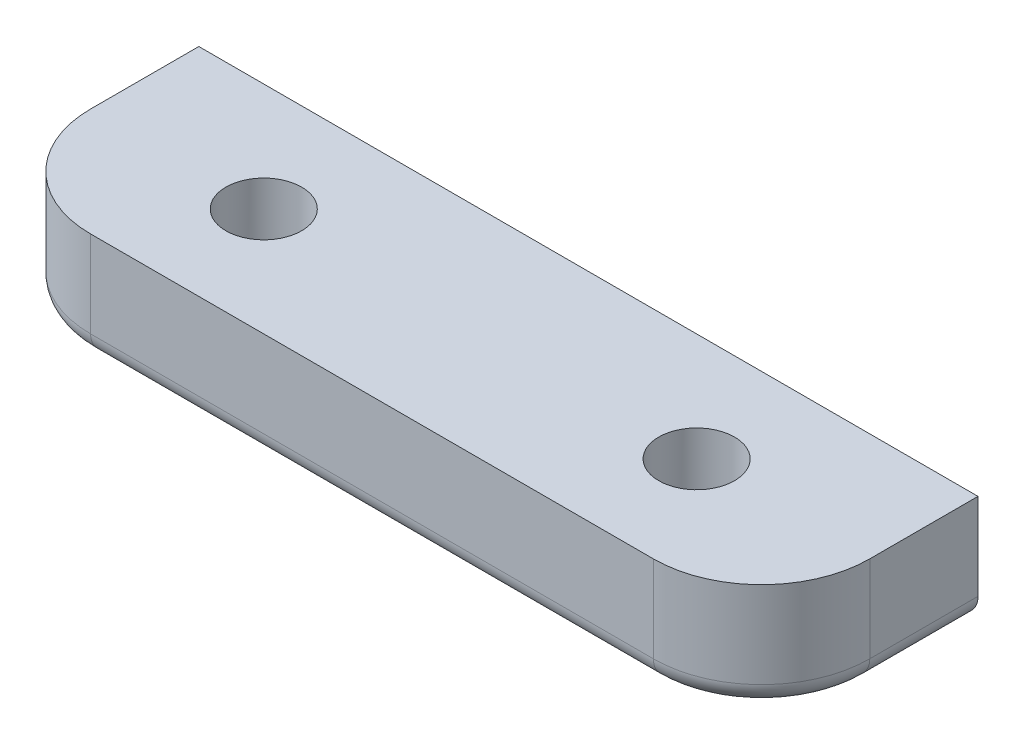
ISO-10303-21;
HEADER;
FILE_DESCRIPTION(('STEP AP214'),'2;1');
FILE_NAME('part.step','',(''),(''),'','','');
FILE_SCHEMA(('AUTOMOTIVE_DESIGN { 1 0 10303 214 1 1 1 1 }'));
ENDSEC;
DATA;
#1=APPLICATION_CONTEXT('core data for automotive mechanical design processes');
#2=APPLICATION_PROTOCOL_DEFINITION('international standard','automotive_design',2000,#1);
#3=PRODUCT_CONTEXT('',#1,'mechanical');
#4=PRODUCT('Part','Part','',(#3));
#5=PRODUCT_RELATED_PRODUCT_CATEGORY('part','',(#4));
#6=PRODUCT_DEFINITION_FORMATION('','',#4);
#7=PRODUCT_DEFINITION_CONTEXT('part definition',#1,'design');
#8=PRODUCT_DEFINITION('design','',#6,#7);
#9=PRODUCT_DEFINITION_SHAPE('','',#8);
#10=(LENGTH_UNIT() NAMED_UNIT(*) SI_UNIT(.MILLI.,.METRE.));
#11=(NAMED_UNIT(*) PLANE_ANGLE_UNIT() SI_UNIT($,.RADIAN.));
#12=(NAMED_UNIT(*) SI_UNIT($,.STERADIAN.) SOLID_ANGLE_UNIT());
#13=UNCERTAINTY_MEASURE_WITH_UNIT(LENGTH_MEASURE(1.E-05),#10,'distance_accuracy_value','');
#14=(GEOMETRIC_REPRESENTATION_CONTEXT(3) GLOBAL_UNCERTAINTY_ASSIGNED_CONTEXT((#13)) GLOBAL_UNIT_ASSIGNED_CONTEXT((#10,
#11,#12)) REPRESENTATION_CONTEXT('',''));
#15=CARTESIAN_POINT('',(0.,0.,0.));
#16=DIRECTION('',(0.,0.,1.));
#17=DIRECTION('',(1.,0.,0.));
#18=AXIS2_PLACEMENT_3D('',#15,#16,#17);
#19=CARTESIAN_POINT('',(10.,-2.5,0.));
#20=DIRECTION('',(0.,1.,0.));
#21=DIRECTION('',(0.,0.,1.));
#22=AXIS2_PLACEMENT_3D('',#19,#20,#21);
#23=CYLINDRICAL_SURFACE('',#22,1.75);
#24=CARTESIAN_POINT('',(10.,2.5,0.));
#25=DIRECTION('',(0.,1.,0.));
#26=DIRECTION('',(0.,0.,1.));
#27=AXIS2_PLACEMENT_3D('',#24,#25,#26);
#28=CIRCLE('',#27,1.75);
#29=CARTESIAN_POINT('',(10.,2.5,1.75));
#30=VERTEX_POINT('',#29);
#31=EDGE_CURVE('E149',#30,#30,#28,.T.);
#32=ORIENTED_EDGE('',*,*,#31,.T.);
#33=EDGE_LOOP('',(#32));
#34=FACE_BOUND('',#33,.T.);
#35=CARTESIAN_POINT('',(10.,-0.5,0.));
#36=DIRECTION('',(0.,-1.,0.));
#37=DIRECTION('',(0.,0.,-1.));
#38=AXIS2_PLACEMENT_3D('',#35,#36,#37);
#39=CIRCLE('',#38,1.75);
#40=CARTESIAN_POINT('',(10.,-0.5,-1.75));
#41=VERTEX_POINT('',#40);
#42=EDGE_CURVE('E145',#41,#41,#39,.F.);
#43=ORIENTED_EDGE('',*,*,#42,.F.);
#44=EDGE_LOOP('',(#43));
#45=FACE_BOUND('',#44,.T.);
#46=ADVANCED_FACE('F36',(#34,#45),#23,.F.);
#47=CARTESIAN_POINT('',(-10.,-2.5,0.));
#48=DIRECTION('',(0.,1.,0.));
#49=DIRECTION('',(0.,0.,1.));
#50=AXIS2_PLACEMENT_3D('',#47,#48,#49);
#51=CYLINDRICAL_SURFACE('',#50,1.75);
#52=CARTESIAN_POINT('',(-10.,2.5,0.));
#53=DIRECTION('',(0.,1.,0.));
#54=DIRECTION('',(0.,0.,1.));
#55=AXIS2_PLACEMENT_3D('',#52,#53,#54);
#56=CIRCLE('',#55,1.75);
#57=CARTESIAN_POINT('',(-10.,2.5,1.75));
#58=VERTEX_POINT('',#57);
#59=EDGE_CURVE('E207',#58,#58,#56,.T.);
#60=ORIENTED_EDGE('',*,*,#59,.T.);
#61=EDGE_LOOP('',(#60));
#62=FACE_BOUND('',#61,.T.);
#63=CARTESIAN_POINT('',(-10.,-0.5,0.));
#64=DIRECTION('',(0.,-1.,0.));
#65=DIRECTION('',(0.,0.,-1.));
#66=AXIS2_PLACEMENT_3D('',#63,#64,#65);
#67=CIRCLE('',#66,1.75);
#68=CARTESIAN_POINT('',(-10.,-0.5,-1.75));
#69=VERTEX_POINT('',#68);
#70=EDGE_CURVE('E142',#69,#69,#67,.F.);
#71=ORIENTED_EDGE('',*,*,#70,.F.);
#72=EDGE_LOOP('',(#71));
#73=FACE_BOUND('',#72,.T.);
#74=ADVANCED_FACE('F260',(#62,#73),#51,.F.);
#75=CARTESIAN_POINT('',(-18.,2.5,5.));
#76=DIRECTION('',(1.,0.,0.));
#77=DIRECTION('',(0.,0.,-1.));
#78=AXIS2_PLACEMENT_3D('',#75,#76,#77);
#79=PLANE('',#78);
#80=DIRECTION('',(0.,-1.,0.));
#81=VECTOR('',#80,1.);
#82=CARTESIAN_POINT('',(-18.,2.5,-5.));
#83=LINE('',#82,#81);
#84=CARTESIAN_POINT('',(-18.,2.5,-5.));
#85=VERTEX_POINT('',#84);
#86=CARTESIAN_POINT('',(-18.,-1.5,-5.));
#87=VERTEX_POINT('',#86);
#88=EDGE_CURVE('E134',#85,#87,#83,.T.);
#89=ORIENTED_EDGE('',*,*,#88,.T.);
#90=DIRECTION('',(0.,0.,-1.));
#91=VECTOR('',#90,1.);
#92=CARTESIAN_POINT('',(-18.,-1.5,5.));
#93=LINE('',#92,#91);
#94=CARTESIAN_POINT('',(-18.,-1.5,0.));
#95=VERTEX_POINT('',#94);
#96=EDGE_CURVE('E175',#87,#95,#93,.F.);
#97=ORIENTED_EDGE('',*,*,#96,.T.);
#98=DIRECTION('',(0.,-1.,0.));
#99=VECTOR('',#98,1.);
#100=CARTESIAN_POINT('',(-18.,2.5,0.));
#101=LINE('',#100,#99);
#102=CARTESIAN_POINT('',(-18.,2.5,0.));
#103=VERTEX_POINT('',#102);
#104=EDGE_CURVE('E153',#95,#103,#101,.F.);
#105=ORIENTED_EDGE('',*,*,#104,.T.);
#106=DIRECTION('',(0.,0.,-1.));
#107=VECTOR('',#106,1.);
#108=CARTESIAN_POINT('',(-18.,2.5,5.));
#109=LINE('',#108,#107);
#110=EDGE_CURVE('E129',#103,#85,#109,.T.);
#111=ORIENTED_EDGE('',*,*,#110,.T.);
#112=EDGE_LOOP('',(#89,#97,#105,#111));
#113=FACE_BOUND('',#112,.T.);
#114=ADVANCED_FACE('F242',(#113),#79,.F.);
#115=CARTESIAN_POINT('',(-18.,-2.5,5.));
#116=DIRECTION('',(0.,1.,0.));
#117=DIRECTION('',(0.,0.,1.));
#118=AXIS2_PLACEMENT_3D('',#115,#116,#117);
#119=PLANE('',#118);
#120=CARTESIAN_POINT('',(-10.,-2.5,0.));
#121=DIRECTION('',(0.,1.,0.));
#122=DIRECTION('',(0.,0.,1.));
#123=AXIS2_PLACEMENT_3D('',#120,#121,#122);
#124=CIRCLE('',#123,3.2);
#125=CARTESIAN_POINT('',(-10.,-2.5,3.2));
#126=VERTEX_POINT('',#125);
#127=EDGE_CURVE('E202',#126,#126,#124,.T.);
#128=ORIENTED_EDGE('',*,*,#127,.T.);
#129=EDGE_LOOP('',(#128));
#130=FACE_BOUND('',#129,.T.);
#131=CARTESIAN_POINT('',(10.,-2.5,0.));
#132=DIRECTION('',(0.,1.,0.));
#133=DIRECTION('',(0.,0.,1.));
#134=AXIS2_PLACEMENT_3D('',#131,#132,#133);
#135=CIRCLE('',#134,3.2);
#136=CARTESIAN_POINT('',(10.,-2.5,3.2));
#137=VERTEX_POINT('',#136);
#138=EDGE_CURVE('E192',#137,#137,#135,.T.);
#139=ORIENTED_EDGE('',*,*,#138,.T.);
#140=EDGE_LOOP('',(#139));
#141=FACE_BOUND('',#140,.T.);
#142=CARTESIAN_POINT('',(-13.,-2.5,0.));
#143=DIRECTION('',(0.,1.,0.));
#144=DIRECTION('',(0.,0.,1.));
#145=AXIS2_PLACEMENT_3D('',#142,#143,#144);
#146=CIRCLE('',#145,4.);
#147=CARTESIAN_POINT('',(-13.,-2.5,4.));
#148=VERTEX_POINT('',#147);
#149=CARTESIAN_POINT('',(-17.,-2.5,0.));
#150=VERTEX_POINT('',#149);
#151=EDGE_CURVE('E166',#148,#150,#146,.F.);
#152=ORIENTED_EDGE('',*,*,#151,.T.);
#153=DIRECTION('',(0.,0.,-1.));
#154=VECTOR('',#153,1.);
#155=CARTESIAN_POINT('',(-17.,-2.5,5.));
#156=LINE('',#155,#154);
#157=CARTESIAN_POINT('',(-17.,-2.5,-5.));
#158=VERTEX_POINT('',#157);
#159=EDGE_CURVE('E168',#150,#158,#156,.T.);
#160=ORIENTED_EDGE('',*,*,#159,.T.);
#161=DIRECTION('',(1.,0.,0.));
#162=VECTOR('',#161,1.);
#163=CARTESIAN_POINT('',(-18.,-2.5,-5.));
#164=LINE('',#163,#162);
#165=CARTESIAN_POINT('',(17.,-2.5,-5.));
#166=VERTEX_POINT('',#165);
#167=EDGE_CURVE('E118',#158,#166,#164,.T.);
#168=ORIENTED_EDGE('',*,*,#167,.T.);
#169=DIRECTION('',(0.,0.,-1.));
#170=VECTOR('',#169,1.);
#171=CARTESIAN_POINT('',(17.,-2.5,5.));
#172=LINE('',#171,#170);
#173=CARTESIAN_POINT('',(17.,-2.5,0.));
#174=VERTEX_POINT('',#173);
#175=EDGE_CURVE('E164',#166,#174,#172,.F.);
#176=ORIENTED_EDGE('',*,*,#175,.T.);
#177=CARTESIAN_POINT('',(13.,-2.5,0.));
#178=DIRECTION('',(0.,1.,0.));
#179=DIRECTION('',(0.,0.,1.));
#180=AXIS2_PLACEMENT_3D('',#177,#178,#179);
#181=CIRCLE('',#180,4.);
#182=CARTESIAN_POINT('',(13.,-2.5,4.));
#183=VERTEX_POINT('',#182);
#184=EDGE_CURVE('E162',#174,#183,#181,.F.);
#185=ORIENTED_EDGE('',*,*,#184,.T.);
#186=DIRECTION('',(1.,0.,0.));
#187=VECTOR('',#186,1.);
#188=CARTESIAN_POINT('',(-13.,-2.5,4.));
#189=LINE('',#188,#187);
#190=EDGE_CURVE('E160',#183,#148,#189,.F.);
#191=ORIENTED_EDGE('',*,*,#190,.T.);
#192=EDGE_LOOP('',(#152,#160,#168,#176,#185,#191));
#193=FACE_BOUND('',#192,.T.);
#194=ADVANCED_FACE('F227',(#130,#141,#193),#119,.F.);
#195=CARTESIAN_POINT('',(18.,2.5,5.));
#196=DIRECTION('',(-1.,0.,0.));
#197=DIRECTION('',(0.,0.,1.));
#198=AXIS2_PLACEMENT_3D('',#195,#196,#197);
#199=PLANE('',#198);
#200=DIRECTION('',(0.,1.,0.));
#201=VECTOR('',#200,1.);
#202=CARTESIAN_POINT('',(18.,-2.5,0.));
#203=LINE('',#202,#201);
#204=CARTESIAN_POINT('',(18.,2.5,0.));
#205=VERTEX_POINT('',#204);
#206=CARTESIAN_POINT('',(18.,-1.5,0.));
#207=VERTEX_POINT('',#206);
#208=EDGE_CURVE('E158',#205,#207,#203,.F.);
#209=ORIENTED_EDGE('',*,*,#208,.T.);
#210=DIRECTION('',(0.,0.,-1.));
#211=VECTOR('',#210,1.);
#212=CARTESIAN_POINT('',(18.,-1.5,5.));
#213=LINE('',#212,#211);
#214=CARTESIAN_POINT('',(18.,-1.5,-5.));
#215=VERTEX_POINT('',#214);
#216=EDGE_CURVE('E113',#207,#215,#213,.T.);
#217=ORIENTED_EDGE('',*,*,#216,.T.);
#218=DIRECTION('',(0.,1.,0.));
#219=VECTOR('',#218,1.);
#220=CARTESIAN_POINT('',(18.,2.5,-5.));
#221=LINE('',#220,#219);
#222=CARTESIAN_POINT('',(18.,2.5,-5.));
#223=VERTEX_POINT('',#222);
#224=EDGE_CURVE('E108',#215,#223,#221,.T.);
#225=ORIENTED_EDGE('',*,*,#224,.T.);
#226=DIRECTION('',(0.,0.,-1.));
#227=VECTOR('',#226,1.);
#228=CARTESIAN_POINT('',(18.,2.5,5.));
#229=LINE('',#228,#227);
#230=EDGE_CURVE('E111',#205,#223,#229,.T.);
#231=ORIENTED_EDGE('',*,*,#230,.F.);
#232=EDGE_LOOP('',(#209,#217,#225,#231));
#233=FACE_BOUND('',#232,.T.);
#234=ADVANCED_FACE('F110',(#233),#199,.F.);
#235=CARTESIAN_POINT('',(-18.,2.5,5.));
#236=DIRECTION('',(0.,-1.,0.));
#237=DIRECTION('',(0.,0.,-1.));
#238=AXIS2_PLACEMENT_3D('',#235,#236,#237);
#239=PLANE('',#238);
#240=ORIENTED_EDGE('',*,*,#59,.F.);
#241=EDGE_LOOP('',(#240));
#242=FACE_BOUND('',#241,.T.);
#243=ORIENTED_EDGE('',*,*,#31,.F.);
#244=EDGE_LOOP('',(#243));
#245=FACE_BOUND('',#244,.T.);
#246=ORIENTED_EDGE('',*,*,#110,.F.);
#247=CARTESIAN_POINT('',(-13.,2.5,0.));
#248=DIRECTION('',(0.,-1.,0.));
#249=DIRECTION('',(0.,0.,-1.));
#250=AXIS2_PLACEMENT_3D('',#247,#248,#249);
#251=CIRCLE('',#250,5.);
#252=CARTESIAN_POINT('',(-13.,2.5,5.));
#253=VERTEX_POINT('',#252);
#254=EDGE_CURVE('E156',#103,#253,#251,.F.);
#255=ORIENTED_EDGE('',*,*,#254,.T.);
#256=DIRECTION('',(-1.,0.,0.));
#257=VECTOR('',#256,1.);
#258=CARTESIAN_POINT('',(-18.,2.5,5.));
#259=LINE('',#258,#257);
#260=CARTESIAN_POINT('',(13.,2.5,5.));
#261=VERTEX_POINT('',#260);
#262=EDGE_CURVE('E135',#261,#253,#259,.T.);
#263=ORIENTED_EDGE('',*,*,#262,.F.);
#264=CARTESIAN_POINT('',(13.,2.5,0.));
#265=DIRECTION('',(0.,-1.,0.));
#266=DIRECTION('',(0.,0.,-1.));
#267=AXIS2_PLACEMENT_3D('',#264,#265,#266);
#268=CIRCLE('',#267,5.);
#269=EDGE_CURVE('E127',#261,#205,#268,.F.);
#270=ORIENTED_EDGE('',*,*,#269,.T.);
#271=ORIENTED_EDGE('',*,*,#230,.T.);
#272=DIRECTION('',(-1.,0.,0.));
#273=VECTOR('',#272,1.);
#274=CARTESIAN_POINT('',(-18.,2.5,-5.));
#275=LINE('',#274,#273);
#276=EDGE_CURVE('E117',#223,#85,#275,.T.);
#277=ORIENTED_EDGE('',*,*,#276,.T.);
#278=EDGE_LOOP('',(#246,#255,#263,#270,#271,#277));
#279=FACE_BOUND('',#278,.T.);
#280=ADVANCED_FACE('F123',(#242,#245,#279),#239,.F.);
#281=CARTESIAN_POINT('',(0.,0.,5.));
#282=DIRECTION('',(0.,0.,1.));
#283=DIRECTION('',(1.,0.,0.));
#284=AXIS2_PLACEMENT_3D('',#281,#282,#283);
#285=PLANE('',#284);
#286=DIRECTION('',(0.,-1.,0.));
#287=VECTOR('',#286,1.);
#288=CARTESIAN_POINT('',(-13.,-2.5,5.));
#289=LINE('',#288,#287);
#290=CARTESIAN_POINT('',(-13.,-1.5,5.));
#291=VERTEX_POINT('',#290);
#292=EDGE_CURVE('E151',#253,#291,#289,.T.);
#293=ORIENTED_EDGE('',*,*,#292,.T.);
#294=DIRECTION('',(1.,0.,0.));
#295=VECTOR('',#294,1.);
#296=CARTESIAN_POINT('',(13.,-1.5,5.));
#297=LINE('',#296,#295);
#298=CARTESIAN_POINT('',(13.,-1.5,5.));
#299=VERTEX_POINT('',#298);
#300=EDGE_CURVE('E12',#291,#299,#297,.T.);
#301=ORIENTED_EDGE('',*,*,#300,.T.);
#302=DIRECTION('',(0.,1.,0.));
#303=VECTOR('',#302,1.);
#304=CARTESIAN_POINT('',(13.,2.5,5.));
#305=LINE('',#304,#303);
#306=EDGE_CURVE('E128',#299,#261,#305,.T.);
#307=ORIENTED_EDGE('',*,*,#306,.T.);
#308=ORIENTED_EDGE('',*,*,#262,.T.);
#309=EDGE_LOOP('',(#293,#301,#307,#308));
#310=FACE_BOUND('',#309,.T.);
#311=ADVANCED_FACE('F248',(#310),#285,.T.);
#312=CARTESIAN_POINT('',(0.,0.,-5.));
#313=DIRECTION('',(0.,0.,1.));
#314=DIRECTION('',(1.,0.,0.));
#315=AXIS2_PLACEMENT_3D('',#312,#313,#314);
#316=PLANE('',#315);
#317=CARTESIAN_POINT('',(14.75,-0.500000000000004,-5.));
#318=DIRECTION('',(0.,0.,-1.));
#319=DIRECTION('',(-1.,0.,0.));
#320=AXIS2_PLACEMENT_3D('',#317,#318,#319);
#321=CIRCLE('',#320,1.);
#322=CARTESIAN_POINT('',(13.75,-0.500000000000004,-5.));
#323=VERTEX_POINT('',#322);
#324=EDGE_CURVE('E216',#323,#323,#321,.T.);
#325=ORIENTED_EDGE('',*,*,#324,.F.);
#326=EDGE_LOOP('',(#325));
#327=FACE_BOUND('',#326,.T.);
#328=CARTESIAN_POINT('',(-14.75,0.,-5.));
#329=DIRECTION('',(0.,0.,-1.));
#330=DIRECTION('',(-1.,0.,0.));
#331=AXIS2_PLACEMENT_3D('',#328,#329,#330);
#332=CIRCLE('',#331,1.);
#333=CARTESIAN_POINT('',(-15.75,0.,-5.));
#334=VERTEX_POINT('',#333);
#335=EDGE_CURVE('E210',#334,#334,#332,.T.);
#336=ORIENTED_EDGE('',*,*,#335,.F.);
#337=EDGE_LOOP('',(#336));
#338=FACE_BOUND('',#337,.T.);
#339=ORIENTED_EDGE('',*,*,#167,.F.);
#340=CARTESIAN_POINT('',(-17.,-1.5,-5.));
#341=DIRECTION('',(0.,0.,1.));
#342=DIRECTION('',(1.,0.,0.));
#343=AXIS2_PLACEMENT_3D('',#340,#341,#342);
#344=CIRCLE('',#343,1.);
#345=EDGE_CURVE('E173',#158,#87,#344,.F.);
#346=ORIENTED_EDGE('',*,*,#345,.T.);
#347=ORIENTED_EDGE('',*,*,#88,.F.);
#348=ORIENTED_EDGE('',*,*,#276,.F.);
#349=ORIENTED_EDGE('',*,*,#224,.F.);
#350=CARTESIAN_POINT('',(17.,-1.5,-5.));
#351=DIRECTION('',(0.,0.,1.));
#352=DIRECTION('',(1.,0.,0.));
#353=AXIS2_PLACEMENT_3D('',#350,#351,#352);
#354=CIRCLE('',#353,1.);
#355=EDGE_CURVE('E171',#215,#166,#354,.F.);
#356=ORIENTED_EDGE('',*,*,#355,.T.);
#357=EDGE_LOOP('',(#339,#346,#347,#348,#349,#356));
#358=FACE_BOUND('',#357,.T.);
#359=ADVANCED_FACE('F132',(#327,#338,#358),#316,.F.);
#360=CARTESIAN_POINT('',(-14.75,0.,4.));
#361=DIRECTION('',(0.,0.,-1.));
#362=DIRECTION('',(-1.,0.,0.));
#363=AXIS2_PLACEMENT_3D('',#360,#361,#362);
#364=CYLINDRICAL_SURFACE('',#363,1.);
#365=CARTESIAN_POINT('',(-14.75,0.,4.));
#366=DIRECTION('',(0.,0.,-1.));
#367=DIRECTION('',(-1.,0.,0.));
#368=AXIS2_PLACEMENT_3D('',#365,#366,#367);
#369=CIRCLE('',#368,1.);
#370=CARTESIAN_POINT('',(-15.75,0.,4.));
#371=VERTEX_POINT('',#370);
#372=EDGE_CURVE('E219',#371,#371,#369,.T.);
#373=ORIENTED_EDGE('',*,*,#372,.F.);
#374=EDGE_LOOP('',(#373));
#375=FACE_BOUND('',#374,.T.);
#376=ORIENTED_EDGE('',*,*,#335,.T.);
#377=EDGE_LOOP('',(#376));
#378=FACE_BOUND('',#377,.T.);
#379=ADVANCED_FACE('F283',(#375,#378),#364,.F.);
#380=CARTESIAN_POINT('',(-14.75,0.,4.));
#381=DIRECTION('',(0.,0.,-1.));
#382=DIRECTION('',(-1.,0.,0.));
#383=AXIS2_PLACEMENT_3D('',#380,#381,#382);
#384=PLANE('',#383);
#385=ORIENTED_EDGE('',*,*,#372,.T.);
#386=EDGE_LOOP('',(#385));
#387=FACE_BOUND('',#386,.T.);
#388=ADVANCED_FACE('F279',(#387),#384,.T.);
#389=CARTESIAN_POINT('',(14.75,-0.500000000000004,4.));
#390=DIRECTION('',(0.,0.,-1.));
#391=DIRECTION('',(-1.,0.,0.));
#392=AXIS2_PLACEMENT_3D('',#389,#390,#391);
#393=CYLINDRICAL_SURFACE('',#392,1.);
#394=CARTESIAN_POINT('',(14.75,-0.500000000000004,4.));
#395=DIRECTION('',(0.,0.,-1.));
#396=DIRECTION('',(-1.,0.,0.));
#397=AXIS2_PLACEMENT_3D('',#394,#395,#396);
#398=CIRCLE('',#397,1.);
#399=CARTESIAN_POINT('',(13.75,-0.500000000000004,4.));
#400=VERTEX_POINT('',#399);
#401=EDGE_CURVE('E213',#400,#400,#398,.T.);
#402=ORIENTED_EDGE('',*,*,#401,.F.);
#403=EDGE_LOOP('',(#402));
#404=FACE_BOUND('',#403,.T.);
#405=ORIENTED_EDGE('',*,*,#324,.T.);
#406=EDGE_LOOP('',(#405));
#407=FACE_BOUND('',#406,.T.);
#408=ADVANCED_FACE('F275',(#404,#407),#393,.F.);
#409=CARTESIAN_POINT('',(14.75,-0.500000000000004,4.));
#410=DIRECTION('',(0.,0.,-1.));
#411=DIRECTION('',(-1.,0.,0.));
#412=AXIS2_PLACEMENT_3D('',#409,#410,#411);
#413=PLANE('',#412);
#414=ORIENTED_EDGE('',*,*,#401,.T.);
#415=EDGE_LOOP('',(#414));
#416=FACE_BOUND('',#415,.T.);
#417=ADVANCED_FACE('F271',(#416),#413,.T.);
#418=CARTESIAN_POINT('',(-18.,-0.5,5.));
#419=DIRECTION('',(0.,-1.,0.));
#420=DIRECTION('',(0.,0.,-1.));
#421=AXIS2_PLACEMENT_3D('',#418,#419,#420);
#422=PLANE('',#421);
#423=CARTESIAN_POINT('',(-10.,-0.5,0.));
#424=DIRECTION('',(0.,-1.,0.));
#425=DIRECTION('',(0.,0.,-1.));
#426=AXIS2_PLACEMENT_3D('',#423,#424,#425);
#427=CIRCLE('',#426,3.2);
#428=CARTESIAN_POINT('',(-10.,-0.5,-3.2));
#429=VERTEX_POINT('',#428);
#430=EDGE_CURVE('E146',#429,#429,#427,.T.);
#431=ORIENTED_EDGE('',*,*,#430,.T.);
#432=EDGE_LOOP('',(#431));
#433=FACE_BOUND('',#432,.T.);
#434=ORIENTED_EDGE('',*,*,#70,.T.);
#435=EDGE_LOOP('',(#434));
#436=FACE_BOUND('',#435,.T.);
#437=ADVANCED_FACE('F274',(#433,#436),#422,.T.);
#438=CARTESIAN_POINT('',(-10.,11.5509667991878,0.));
#439=DIRECTION('',(0.,-1.,0.));
#440=DIRECTION('',(0.,0.,-1.));
#441=AXIS2_PLACEMENT_3D('',#438,#439,#440);
#442=CYLINDRICAL_SURFACE('',#441,3.2);
#443=ORIENTED_EDGE('',*,*,#430,.F.);
#444=EDGE_LOOP('',(#443));
#445=FACE_BOUND('',#444,.T.);
#446=ORIENTED_EDGE('',*,*,#127,.F.);
#447=EDGE_LOOP('',(#446));
#448=FACE_BOUND('',#447,.T.);
#449=ADVANCED_FACE('F350',(#445,#448),#442,.F.);
#450=CARTESIAN_POINT('',(-18.,-0.5,5.));
#451=DIRECTION('',(0.,-1.,0.));
#452=DIRECTION('',(0.,0.,-1.));
#453=AXIS2_PLACEMENT_3D('',#450,#451,#452);
#454=PLANE('',#453);
#455=CARTESIAN_POINT('',(10.,-0.5,0.));
#456=DIRECTION('',(0.,-1.,0.));
#457=DIRECTION('',(0.,0.,-1.));
#458=AXIS2_PLACEMENT_3D('',#455,#456,#457);
#459=CIRCLE('',#458,3.2);
#460=CARTESIAN_POINT('',(10.,-0.5,-3.2));
#461=VERTEX_POINT('',#460);
#462=EDGE_CURVE('E197',#461,#461,#459,.T.);
#463=ORIENTED_EDGE('',*,*,#462,.T.);
#464=EDGE_LOOP('',(#463));
#465=FACE_BOUND('',#464,.T.);
#466=ORIENTED_EDGE('',*,*,#42,.T.);
#467=EDGE_LOOP('',(#466));
#468=FACE_BOUND('',#467,.T.);
#469=ADVANCED_FACE('F358',(#465,#468),#454,.T.);
#470=CARTESIAN_POINT('',(10.,11.5509667991878,0.));
#471=DIRECTION('',(0.,-1.,0.));
#472=DIRECTION('',(0.,0.,-1.));
#473=AXIS2_PLACEMENT_3D('',#470,#471,#472);
#474=CYLINDRICAL_SURFACE('',#473,3.2);
#475=ORIENTED_EDGE('',*,*,#462,.F.);
#476=EDGE_LOOP('',(#475));
#477=FACE_BOUND('',#476,.T.);
#478=ORIENTED_EDGE('',*,*,#138,.F.);
#479=EDGE_LOOP('',(#478));
#480=FACE_BOUND('',#479,.T.);
#481=ADVANCED_FACE('F256',(#477,#480),#474,.F.);
#482=CARTESIAN_POINT('',(-13.,0.,0.));
#483=DIRECTION('',(0.,1.,0.));
#484=DIRECTION('',(0.,0.,1.));
#485=AXIS2_PLACEMENT_3D('',#482,#483,#484);
#486=CYLINDRICAL_SURFACE('',#485,5.);
#487=ORIENTED_EDGE('',*,*,#104,.F.);
#488=CARTESIAN_POINT('',(-13.,-1.5,0.));
#489=DIRECTION('',(0.,1.,0.));
#490=DIRECTION('',(0.,0.,1.));
#491=AXIS2_PLACEMENT_3D('',#488,#489,#490);
#492=CIRCLE('',#491,5.);
#493=EDGE_CURVE('E177',#95,#291,#492,.T.);
#494=ORIENTED_EDGE('',*,*,#493,.T.);
#495=ORIENTED_EDGE('',*,*,#292,.F.);
#496=ORIENTED_EDGE('',*,*,#254,.F.);
#497=EDGE_LOOP('',(#487,#494,#495,#496));
#498=FACE_BOUND('',#497,.T.);
#499=ADVANCED_FACE('F247',(#498),#486,.T.);
#500=CARTESIAN_POINT('',(13.,0.,0.));
#501=DIRECTION('',(0.,-1.,0.));
#502=DIRECTION('',(0.,0.,-1.));
#503=AXIS2_PLACEMENT_3D('',#500,#501,#502);
#504=CYLINDRICAL_SURFACE('',#503,5.);
#505=ORIENTED_EDGE('',*,*,#306,.F.);
#506=CARTESIAN_POINT('',(13.,-1.5,0.));
#507=DIRECTION('',(0.,1.,0.));
#508=DIRECTION('',(0.,0.,1.));
#509=AXIS2_PLACEMENT_3D('',#506,#507,#508);
#510=CIRCLE('',#509,5.);
#511=EDGE_CURVE('E45',#299,#207,#510,.T.);
#512=ORIENTED_EDGE('',*,*,#511,.T.);
#513=ORIENTED_EDGE('',*,*,#208,.F.);
#514=ORIENTED_EDGE('',*,*,#269,.F.);
#515=EDGE_LOOP('',(#505,#512,#513,#514));
#516=FACE_BOUND('',#515,.T.);
#517=ADVANCED_FACE('F249',(#516),#504,.T.);
#518=CARTESIAN_POINT('',(17.,-1.5,5.));
#519=DIRECTION('',(0.,0.,-1.));
#520=DIRECTION('',(-1.,0.,0.));
#521=AXIS2_PLACEMENT_3D('',#518,#519,#520);
#522=CYLINDRICAL_SURFACE('',#521,1.);
#523=ORIENTED_EDGE('',*,*,#355,.F.);
#524=ORIENTED_EDGE('',*,*,#216,.F.);
#525=CARTESIAN_POINT('',(17.,-1.5,0.));
#526=DIRECTION('',(0.,0.,1.));
#527=DIRECTION('',(1.,0.,0.));
#528=AXIS2_PLACEMENT_3D('',#525,#526,#527);
#529=CIRCLE('',#528,1.);
#530=EDGE_CURVE('E40',#174,#207,#529,.T.);
#531=ORIENTED_EDGE('',*,*,#530,.F.);
#532=ORIENTED_EDGE('',*,*,#175,.F.);
#533=EDGE_LOOP('',(#523,#524,#531,#532));
#534=FACE_BOUND('',#533,.T.);
#535=ADVANCED_FACE('F38',(#534),#522,.T.);
#536=CARTESIAN_POINT('',(13.,-1.5,0.));
#537=DIRECTION('',(0.,1.,0.));
#538=DIRECTION('',(0.,0.,1.));
#539=AXIS2_PLACEMENT_3D('',#536,#537,#538);
#540=TOROIDAL_SURFACE('',#539,4.,1.);
#541=ORIENTED_EDGE('',*,*,#530,.T.);
#542=ORIENTED_EDGE('',*,*,#511,.F.);
#543=CARTESIAN_POINT('',(13.,-1.5,4.));
#544=DIRECTION('',(-1.,0.,0.));
#545=DIRECTION('',(0.,0.,1.));
#546=AXIS2_PLACEMENT_3D('',#543,#544,#545);
#547=CIRCLE('',#546,1.);
#548=EDGE_CURVE('E186',#183,#299,#547,.T.);
#549=ORIENTED_EDGE('',*,*,#548,.F.);
#550=ORIENTED_EDGE('',*,*,#184,.F.);
#551=EDGE_LOOP('',(#541,#542,#549,#550));
#552=FACE_BOUND('',#551,.T.);
#553=ADVANCED_FACE('F230',(#552),#540,.T.);
#554=CARTESIAN_POINT('',(0.,-1.5,4.));
#555=DIRECTION('',(-1.,0.,0.));
#556=DIRECTION('',(0.,0.,1.));
#557=AXIS2_PLACEMENT_3D('',#554,#555,#556);
#558=CYLINDRICAL_SURFACE('',#557,1.);
#559=ORIENTED_EDGE('',*,*,#548,.T.);
#560=ORIENTED_EDGE('',*,*,#300,.F.);
#561=CARTESIAN_POINT('',(-13.,-1.5,4.));
#562=DIRECTION('',(-1.,0.,0.));
#563=DIRECTION('',(0.,0.,1.));
#564=AXIS2_PLACEMENT_3D('',#561,#562,#563);
#565=CIRCLE('',#564,1.);
#566=EDGE_CURVE('E184',#148,#291,#565,.T.);
#567=ORIENTED_EDGE('',*,*,#566,.F.);
#568=ORIENTED_EDGE('',*,*,#190,.F.);
#569=EDGE_LOOP('',(#559,#560,#567,#568));
#570=FACE_BOUND('',#569,.T.);
#571=ADVANCED_FACE('F234',(#570),#558,.T.);
#572=CARTESIAN_POINT('',(-13.,-1.5,0.));
#573=DIRECTION('',(0.,1.,0.));
#574=DIRECTION('',(0.,0.,1.));
#575=AXIS2_PLACEMENT_3D('',#572,#573,#574);
#576=TOROIDAL_SURFACE('',#575,4.,1.);
#577=ORIENTED_EDGE('',*,*,#566,.T.);
#578=ORIENTED_EDGE('',*,*,#493,.F.);
#579=CARTESIAN_POINT('',(-17.,-1.5,0.));
#580=DIRECTION('',(0.,0.,-1.));
#581=DIRECTION('',(-1.,0.,0.));
#582=AXIS2_PLACEMENT_3D('',#579,#580,#581);
#583=CIRCLE('',#582,1.);
#584=EDGE_CURVE('E181',#150,#95,#583,.T.);
#585=ORIENTED_EDGE('',*,*,#584,.F.);
#586=ORIENTED_EDGE('',*,*,#151,.F.);
#587=EDGE_LOOP('',(#577,#578,#585,#586));
#588=FACE_BOUND('',#587,.T.);
#589=ADVANCED_FACE('F237',(#588),#576,.T.);
#590=CARTESIAN_POINT('',(-17.,-1.5,5.));
#591=DIRECTION('',(0.,0.,-1.));
#592=DIRECTION('',(-1.,0.,0.));
#593=AXIS2_PLACEMENT_3D('',#590,#591,#592);
#594=CYLINDRICAL_SURFACE('',#593,1.);
#595=ORIENTED_EDGE('',*,*,#584,.T.);
#596=ORIENTED_EDGE('',*,*,#96,.F.);
#597=ORIENTED_EDGE('',*,*,#345,.F.);
#598=ORIENTED_EDGE('',*,*,#159,.F.);
#599=EDGE_LOOP('',(#595,#596,#597,#598));
#600=FACE_BOUND('',#599,.T.);
#601=ADVANCED_FACE('F240',(#600),#594,.T.);
#602=CLOSED_SHELL('',(#46,#74,#114,#194,#234,#280,#311,#359,#379,#388,#408,#417,#437,#449,#469,
#481,#499,#517,#535,#553,#571,#589,#601));
#603=MANIFOLD_SOLID_BREP('B2',#602);
#604=ADVANCED_BREP_SHAPE_REPRESENTATION('',(#18,#603),#14);
#605=SHAPE_DEFINITION_REPRESENTATION(#9,#604);
ENDSEC;
END-ISO-10303-21;
